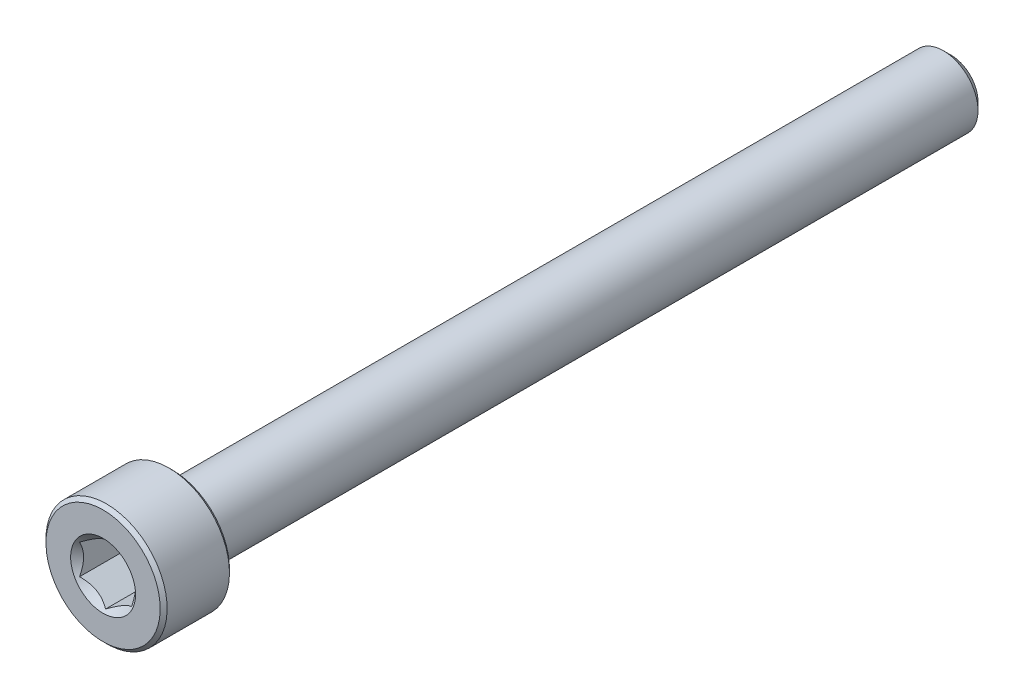
ISO-10303-21;
HEADER;
FILE_DESCRIPTION(('STEP AP214'),'2;1');
FILE_NAME('part.step','',(''),(''),'','','');
FILE_SCHEMA(('AUTOMOTIVE_DESIGN { 1 0 10303 214 1 1 1 1 }'));
ENDSEC;
DATA;
#1=APPLICATION_CONTEXT('core data for automotive mechanical design processes');
#2=APPLICATION_PROTOCOL_DEFINITION('international standard','automotive_design',2000,#1);
#3=PRODUCT_CONTEXT('',#1,'mechanical');
#4=PRODUCT('Part','Part','',(#3));
#5=PRODUCT_RELATED_PRODUCT_CATEGORY('part','',(#4));
#6=PRODUCT_DEFINITION_FORMATION('','',#4);
#7=PRODUCT_DEFINITION_CONTEXT('part definition',#1,'design');
#8=PRODUCT_DEFINITION('design','',#6,#7);
#9=PRODUCT_DEFINITION_SHAPE('','',#8);
#10=(LENGTH_UNIT() NAMED_UNIT(*) SI_UNIT(.MILLI.,.METRE.));
#11=(NAMED_UNIT(*) PLANE_ANGLE_UNIT() SI_UNIT($,.RADIAN.));
#12=(NAMED_UNIT(*) SI_UNIT($,.STERADIAN.) SOLID_ANGLE_UNIT());
#13=UNCERTAINTY_MEASURE_WITH_UNIT(LENGTH_MEASURE(1.E-05),#10,'distance_accuracy_value','');
#14=(GEOMETRIC_REPRESENTATION_CONTEXT(3) GLOBAL_UNCERTAINTY_ASSIGNED_CONTEXT((#13)) GLOBAL_UNIT_ASSIGNED_CONTEXT((#10,
#11,#12)) REPRESENTATION_CONTEXT('',''));
#15=CARTESIAN_POINT('',(0.,0.,0.));
#16=DIRECTION('',(0.,0.,1.));
#17=DIRECTION('',(1.,0.,0.));
#18=AXIS2_PLACEMENT_3D('',#15,#16,#17);
#19=CARTESIAN_POINT('',(0.,1.54533666301316,-24.5));
#20=DIRECTION('',(0.,0.,-1.));
#21=DIRECTION('',(0.,1.,0.));
#22=AXIS2_PLACEMENT_3D('',#19,#20,#21);
#23=PLANE('',#22);
#24=CARTESIAN_POINT('',(0.,0.,-24.5));
#25=DIRECTION('',(0.,0.,-1.));
#26=DIRECTION('',(0.,1.,0.));
#27=AXIS2_PLACEMENT_3D('',#24,#25,#26);
#28=CIRCLE('',#27,1.54533666301316);
#29=CARTESIAN_POINT('',(0.,1.54533666301316,-24.5));
#30=VERTEX_POINT('',#29);
#31=EDGE_CURVE('E54',#30,#30,#28,.T.);
#32=ORIENTED_EDGE('',*,*,#31,.T.);
#33=EDGE_LOOP('',(#32));
#34=FACE_BOUND('',#33,.T.);
#35=ADVANCED_FACE('F41',(#34),#23,.T.);
#36=CARTESIAN_POINT('',(0.,0.,-24.5));
#37=DIRECTION('',(0.,0.,1.));
#38=DIRECTION('',(0.,-1.,0.));
#39=AXIS2_PLACEMENT_3D('',#36,#37,#38);
#40=CONICAL_SURFACE('',#39,1.54533666301316,0.785398163397442);
#41=CARTESIAN_POINT('',(0.,0.,-24.0453366630132));
#42=DIRECTION('',(0.,0.,-1.));
#43=DIRECTION('',(0.,1.,0.));
#44=AXIS2_PLACEMENT_3D('',#41,#42,#43);
#45=CIRCLE('',#44,2.);
#46=CARTESIAN_POINT('',(0.,2.,-24.0453366630132));
#47=VERTEX_POINT('',#46);
#48=EDGE_CURVE('E157',#47,#47,#45,.T.);
#49=ORIENTED_EDGE('',*,*,#48,.T.);
#50=EDGE_LOOP('',(#49));
#51=FACE_BOUND('',#50,.T.);
#52=ORIENTED_EDGE('',*,*,#31,.F.);
#53=EDGE_LOOP('',(#52));
#54=FACE_BOUND('',#53,.T.);
#55=ADVANCED_FACE('F163',(#51,#54),#40,.T.);
#56=CARTESIAN_POINT('',(0.,0.,-24.5));
#57=DIRECTION('',(0.,0.,-1.));
#58=DIRECTION('',(0.,1.,0.));
#59=AXIS2_PLACEMENT_3D('',#56,#57,#58);
#60=CYLINDRICAL_SURFACE('',#59,2.);
#61=CARTESIAN_POINT('',(0.,0.,20.3));
#62=DIRECTION('',(0.,0.,-1.));
#63=DIRECTION('',(0.,1.,0.));
#64=AXIS2_PLACEMENT_3D('',#61,#62,#63);
#65=CIRCLE('',#64,2.);
#66=CARTESIAN_POINT('',(0.,2.,20.3));
#67=VERTEX_POINT('',#66);
#68=EDGE_CURVE('E154',#67,#67,#65,.T.);
#69=ORIENTED_EDGE('',*,*,#68,.T.);
#70=EDGE_LOOP('',(#69));
#71=FACE_BOUND('',#70,.T.);
#72=ORIENTED_EDGE('',*,*,#48,.F.);
#73=EDGE_LOOP('',(#72));
#74=FACE_BOUND('',#73,.T.);
#75=ADVANCED_FACE('F165',(#71,#74),#60,.T.);
#76=CARTESIAN_POINT('',(0.,0.,20.3));
#77=DIRECTION('',(0.,0.,-1.));
#78=DIRECTION('',(0.,1.,0.));
#79=AXIS2_PLACEMENT_3D('',#76,#77,#78);
#80=TOROIDAL_SURFACE('',#79,2.2,0.2);
#81=CARTESIAN_POINT('',(0.,0.,20.5));
#82=DIRECTION('',(0.,0.,-1.));
#83=DIRECTION('',(0.,1.,0.));
#84=AXIS2_PLACEMENT_3D('',#81,#82,#83);
#85=CIRCLE('',#84,2.2);
#86=CARTESIAN_POINT('',(0.,2.2,20.5));
#87=VERTEX_POINT('',#86);
#88=EDGE_CURVE('E151',#87,#87,#85,.T.);
#89=ORIENTED_EDGE('',*,*,#88,.T.);
#90=EDGE_LOOP('',(#89));
#91=FACE_BOUND('',#90,.T.);
#92=ORIENTED_EDGE('',*,*,#68,.F.);
#93=EDGE_LOOP('',(#92));
#94=FACE_BOUND('',#93,.T.);
#95=ADVANCED_FACE('F171',(#91,#94),#80,.F.);
#96=CARTESIAN_POINT('',(0.,3.3,20.5));
#97=DIRECTION('',(0.,0.,-1.));
#98=DIRECTION('',(0.,1.,0.));
#99=AXIS2_PLACEMENT_3D('',#96,#97,#98);
#100=PLANE('',#99);
#101=CARTESIAN_POINT('',(0.,0.,20.5));
#102=DIRECTION('',(0.,0.,-1.));
#103=DIRECTION('',(0.,1.,0.));
#104=AXIS2_PLACEMENT_3D('',#101,#102,#103);
#105=CIRCLE('',#104,3.3);
#106=CARTESIAN_POINT('',(0.,3.3,20.5));
#107=VERTEX_POINT('',#106);
#108=EDGE_CURVE('E148',#107,#107,#105,.T.);
#109=ORIENTED_EDGE('',*,*,#108,.T.);
#110=EDGE_LOOP('',(#109));
#111=FACE_BOUND('',#110,.T.);
#112=ORIENTED_EDGE('',*,*,#88,.F.);
#113=EDGE_LOOP('',(#112));
#114=FACE_BOUND('',#113,.T.);
#115=ADVANCED_FACE('F177',(#111,#114),#100,.T.);
#116=CARTESIAN_POINT('',(0.,0.,20.5));
#117=DIRECTION('',(0.,0.,1.));
#118=DIRECTION('',(0.,-1.,0.));
#119=AXIS2_PLACEMENT_3D('',#116,#117,#118);
#120=CONICAL_SURFACE('',#119,3.3,0.785398163397452);
#121=CARTESIAN_POINT('',(0.,0.,20.7));
#122=DIRECTION('',(0.,0.,-1.));
#123=DIRECTION('',(0.,1.,0.));
#124=AXIS2_PLACEMENT_3D('',#121,#122,#123);
#125=CIRCLE('',#124,3.5);
#126=CARTESIAN_POINT('',(0.,3.5,20.7));
#127=VERTEX_POINT('',#126);
#128=EDGE_CURVE('E145',#127,#127,#125,.T.);
#129=ORIENTED_EDGE('',*,*,#128,.T.);
#130=EDGE_LOOP('',(#129));
#131=FACE_BOUND('',#130,.T.);
#132=ORIENTED_EDGE('',*,*,#108,.F.);
#133=EDGE_LOOP('',(#132));
#134=FACE_BOUND('',#133,.T.);
#135=ADVANCED_FACE('F181',(#131,#134),#120,.T.);
#136=CARTESIAN_POINT('',(0.,0.,-24.5));
#137=DIRECTION('',(0.,0.,-1.));
#138=DIRECTION('',(0.,1.,0.));
#139=AXIS2_PLACEMENT_3D('',#136,#137,#138);
#140=CYLINDRICAL_SURFACE('',#139,3.5);
#141=CARTESIAN_POINT('',(0.,0.,24.3));
#142=DIRECTION('',(0.,0.,-1.));
#143=DIRECTION('',(0.,1.,0.));
#144=AXIS2_PLACEMENT_3D('',#141,#142,#143);
#145=CIRCLE('',#144,3.5);
#146=CARTESIAN_POINT('',(0.,3.5,24.3));
#147=VERTEX_POINT('',#146);
#148=EDGE_CURVE('E142',#147,#147,#145,.T.);
#149=ORIENTED_EDGE('',*,*,#148,.T.);
#150=EDGE_LOOP('',(#149));
#151=FACE_BOUND('',#150,.T.);
#152=ORIENTED_EDGE('',*,*,#128,.F.);
#153=EDGE_LOOP('',(#152));
#154=FACE_BOUND('',#153,.T.);
#155=ADVANCED_FACE('F185',(#151,#154),#140,.T.);
#156=CARTESIAN_POINT('',(0.,0.,24.3));
#157=DIRECTION('',(0.,0.,-1.));
#158=DIRECTION('',(0.,1.,0.));
#159=AXIS2_PLACEMENT_3D('',#156,#157,#158);
#160=CONICAL_SURFACE('',#159,3.5,0.785398163397452);
#161=CARTESIAN_POINT('',(0.,0.,24.5));
#162=DIRECTION('',(0.,0.,-1.));
#163=DIRECTION('',(0.,1.,0.));
#164=AXIS2_PLACEMENT_3D('',#161,#162,#163);
#165=CIRCLE('',#164,3.3);
#166=CARTESIAN_POINT('',(0.,3.3,24.5));
#167=VERTEX_POINT('',#166);
#168=EDGE_CURVE('E139',#167,#167,#165,.T.);
#169=ORIENTED_EDGE('',*,*,#168,.T.);
#170=EDGE_LOOP('',(#169));
#171=FACE_BOUND('',#170,.T.);
#172=ORIENTED_EDGE('',*,*,#148,.F.);
#173=EDGE_LOOP('',(#172));
#174=FACE_BOUND('',#173,.T.);
#175=ADVANCED_FACE('F189',(#171,#174),#160,.T.);
#176=CARTESIAN_POINT('',(0.,0.,24.5));
#177=DIRECTION('',(0.,0.,1.));
#178=DIRECTION('',(0.,-1.,0.));
#179=AXIS2_PLACEMENT_3D('',#176,#177,#178);
#180=PLANE('',#179);
#181=CARTESIAN_POINT('',(0.,0.,24.5));
#182=DIRECTION('',(0.,0.,1.));
#183=DIRECTION('',(1.,0.,0.));
#184=AXIS2_PLACEMENT_3D('',#181,#182,#183);
#185=CIRCLE('',#184,1.875);
#186=CARTESIAN_POINT('',(1.875,0.,24.5));
#187=VERTEX_POINT('',#186);
#188=EDGE_CURVE('E113',#187,#187,#185,.T.);
#189=ORIENTED_EDGE('',*,*,#188,.F.);
#190=EDGE_LOOP('',(#189));
#191=FACE_BOUND('',#190,.T.);
#192=ORIENTED_EDGE('',*,*,#168,.F.);
#193=EDGE_LOOP('',(#192));
#194=FACE_BOUND('',#193,.T.);
#195=ADVANCED_FACE('F193',(#191,#194),#180,.T.);
#196=CARTESIAN_POINT('',(0.,0.,24.5));
#197=DIRECTION('',(0.,0.,1.));
#198=DIRECTION('',(1.,0.,0.));
#199=AXIS2_PLACEMENT_3D('',#196,#197,#198);
#200=CONICAL_SURFACE('',#199,1.875,0.78539816339745);
#201=ORIENTED_EDGE('',*,*,#188,.T.);
#202=EDGE_LOOP('',(#201));
#203=FACE_BOUND('',#202,.T.);
#204=CARTESIAN_POINT('',(-0.000199999999999927,-1.73216627762272,24.357166289169));
#205=CARTESIAN_POINT('',(0.0513677907370756,-1.70239359975915,24.3274162836362));
#206=CARTESIAN_POINT('',(0.103797917665201,-1.67212305186355,24.2994132914792));
#207=CARTESIAN_POINT('',(0.210709034055597,-1.61039789003619,24.248140038009));
#208=CARTESIAN_POINT('',(0.265200195814662,-1.57893740312614,24.2248983126132));
#209=CARTESIAN_POINT('',(0.37507908135725,-1.51549879897987,24.1850845365611));
#210=CARTESIAN_POINT('',(0.430438809095201,-1.4835368452681,24.1684123932398));
#211=CARTESIAN_POINT('',(0.542377257477152,-1.41890915196211,24.142725264387));
#212=CARTESIAN_POINT('',(0.59895255655301,-1.38624538781118,24.1336910980477));
#213=CARTESIAN_POINT('',(0.696455389516442,-1.32995210095299,24.1255398887957));
#214=CARTESIAN_POINT('',(0.737256908280467,-1.30639533311124,24.1243330605581));
#215=CARTESIAN_POINT('',(0.818787969615859,-1.25932335290193,24.1263648647311));
#216=CARTESIAN_POINT('',(0.859517494314631,-1.23580815085313,24.1296044783172));
#217=CARTESIAN_POINT('',(0.940584402163417,-1.18900414978427,24.1403427935508));
#218=CARTESIAN_POINT('',(0.980921384598288,-1.16571558211719,24.1478454605876));
#219=CARTESIAN_POINT('',(1.06091833691403,-1.11952932016335,24.1667024194972));
#220=CARTESIAN_POINT('',(1.10057800851621,-1.09663179808786,24.1780583645875));
#221=CARTESIAN_POINT('',(1.20216313477449,-1.03798159809698,24.2117724551616));
#222=CARTESIAN_POINT('',(1.26345855370969,-1.00259267147465,24.2366726566622));
#223=CARTESIAN_POINT('',(1.35358562846331,-0.950557780604374,24.2787074608405));
#224=CARTESIAN_POINT('',(1.38328513990772,-0.933410759677147,24.293475961128));
#225=CARTESIAN_POINT('',(1.44213790138375,-0.899432101996407,24.324361373509));
#226=CARTESIAN_POINT('',(1.47129140422064,-0.88260031928571,24.3404776416906));
#227=CARTESIAN_POINT('',(1.5002,-0.865909933730601,24.357166289169));
#228=B_SPLINE_CURVE_WITH_KNOTS('',3,(#204,#205,#206,#207,#208,#209,#210,#211,#212,#213,#214,
#215,#216,#217,#218,#219,#220,#221,#222,#223,#224,#225,#226,#227),.UNSPECIFIED.,.F.,.F.,(4,2,2,
2,2,2,2,2,2,2,2,4),(0.,0.199829143693306,0.40082298738239,0.598623720538183,0.795926240188891,
0.937113067959882,1.07833105577193,1.21968061668222,1.36109089931055,1.58570969637566,
1.69770705470964,1.80965120737194),.UNSPECIFIED.);
#229=CARTESIAN_POINT('',(0.,-1.73205080756888,24.3570508075689));
#230=VERTEX_POINT('',#229);
#231=CARTESIAN_POINT('',(1.5,-0.866025403784439,24.3570508075689));
#232=VERTEX_POINT('',#231);
#233=EDGE_CURVE('E12',#230,#232,#228,.T.);
#234=ORIENTED_EDGE('',*,*,#233,.F.);
#235=CARTESIAN_POINT('',(-1.5002,-0.865909933730601,24.357166289169));
#236=CARTESIAN_POINT('',(-1.44863220926292,-0.895682611594166,24.3274162836362));
#237=CARTESIAN_POINT('',(-1.3962020823348,-0.925953159489765,24.2994132914792));
#238=CARTESIAN_POINT('',(-1.2892909659444,-0.987678321317124,24.248140038009));
#239=CARTESIAN_POINT('',(-1.23479980418534,-1.01913880822718,24.2248983126132));
#240=CARTESIAN_POINT('',(-1.12492091864275,-1.08257741237344,24.1850845365611));
#241=CARTESIAN_POINT('',(-1.0695611909048,-1.11453936608521,24.1684123932398));
#242=CARTESIAN_POINT('',(-0.957622742522848,-1.1791670593912,24.142725264387));
#243=CARTESIAN_POINT('',(-0.90104744344699,-1.21183082354213,24.1336910980477));
#244=CARTESIAN_POINT('',(-0.803544610483558,-1.26812411040032,24.1255398887957));
#245=CARTESIAN_POINT('',(-0.762743091719533,-1.29168087824208,24.1243330605581));
#246=CARTESIAN_POINT('',(-0.681212030384141,-1.33875285845138,24.1263648647311));
#247=CARTESIAN_POINT('',(-0.640482505685369,-1.36226806050018,24.1296044783172));
#248=CARTESIAN_POINT('',(-0.559415597836583,-1.40907206156905,24.1403427935508));
#249=CARTESIAN_POINT('',(-0.519078615401711,-1.43236062923612,24.1478454605876));
#250=CARTESIAN_POINT('',(-0.439081663085968,-1.47854689118997,24.1667024194972));
#251=CARTESIAN_POINT('',(-0.399421991483791,-1.50144441326545,24.1780583645875));
#252=CARTESIAN_POINT('',(-0.297836865225514,-1.56009461325633,24.2117724551616));
#253=CARTESIAN_POINT('',(-0.23654144629031,-1.59548353987866,24.2366726566622));
#254=CARTESIAN_POINT('',(-0.146414371536685,-1.64751843074894,24.2787074608405));
#255=CARTESIAN_POINT('',(-0.116714860092281,-1.66466545167617,24.293475961128));
#256=CARTESIAN_POINT('',(-0.0578620986162481,-1.69864410935691,24.324361373509));
#257=CARTESIAN_POINT('',(-0.0287085957793623,-1.71547589206761,24.3404776416906));
#258=CARTESIAN_POINT('',(0.000200000000000097,-1.73216627762272,24.357166289169));
#259=B_SPLINE_CURVE_WITH_KNOTS('',3,(#235,#236,#237,#238,#239,#240,#241,#242,#243,#244,#245,
#246,#247,#248,#249,#250,#251,#252,#253,#254,#255,#256,#257,#258),.UNSPECIFIED.,.F.,.F.,(4,2,2,
2,2,2,2,2,2,2,2,4),(0.,0.199829143693305,0.40082298738239,0.598623720538183,0.795926240188891,
0.937113067959882,1.07833105577193,1.21968061668222,1.36109089931055,1.58570969637566,
1.69770705470964,1.80965120737194),.UNSPECIFIED.);
#260=CARTESIAN_POINT('',(-1.5,-0.866025403784439,24.3570508075689));
#261=VERTEX_POINT('',#260);
#262=EDGE_CURVE('E99',#261,#230,#259,.T.);
#263=ORIENTED_EDGE('',*,*,#262,.F.);
#264=CARTESIAN_POINT('',(-1.5,-1.82724616303013,24.9890703331983));
#265=CARTESIAN_POINT('',(-1.5,-1.78317586660663,24.9550123999568));
#266=CARTESIAN_POINT('',(-1.5,-1.73887128511932,24.9212586157948));
#267=CARTESIAN_POINT('',(-1.5,-1.64969483826883,24.8544877722609));
#268=CARTESIAN_POINT('',(-1.5,-1.60482284303167,24.8214708865189));
#269=CARTESIAN_POINT('',(-1.5,-1.46855205058729,24.72324713276));
#270=CARTESIAN_POINT('',(-1.5,-1.37616527732981,24.6593888798091));
#271=CARTESIAN_POINT('',(-1.5,-1.18175814530896,24.5330655524142));
#272=CARTESIAN_POINT('',(-1.5,-1.07950173722928,24.4709600161031));
#273=CARTESIAN_POINT('',(-1.5,-0.869762030917011,24.3566969236549));
#274=CARTESIAN_POINT('',(-1.5,-0.762297993140726,24.3045057692236));
#275=CARTESIAN_POINT('',(-1.5,-0.601919355462973,24.2406274554858));
#276=CARTESIAN_POINT('',(-1.5,-0.551595099321827,24.2224734484817));
#277=CARTESIAN_POINT('',(-1.5,-0.449644044337812,24.1901962813812));
#278=CARTESIAN_POINT('',(-1.5,-0.398017164202741,24.1760733735321));
#279=CARTESIAN_POINT('',(-1.5,-0.294682921970128,24.1528602513053));
#280=CARTESIAN_POINT('',(-1.5,-0.242996732973226,24.1436773283499));
#281=CARTESIAN_POINT('',(-1.5,-0.138960185913601,24.1305401053432));
#282=CARTESIAN_POINT('',(-1.5,-0.0866099744986986,24.1265846704339));
#283=CARTESIAN_POINT('',(-1.5,0.0158213358469623,24.124249444396));
#284=CARTESIAN_POINT('',(-1.5,0.0658968533581915,24.125623217201));
#285=CARTESIAN_POINT('',(-1.5,0.165665754885725,24.1333003845672));
#286=CARTESIAN_POINT('',(-1.5,0.215359104450811,24.1396042184171));
#287=CARTESIAN_POINT('',(-1.5,0.314848006923594,24.1568886317293));
#288=CARTESIAN_POINT('',(-1.5,0.364628847818079,24.1679525303483));
#289=CARTESIAN_POINT('',(-1.5,0.463087713283467,24.1941391623975));
#290=CARTESIAN_POINT('',(-1.5,0.511765792737123,24.2092616933524));
#291=CARTESIAN_POINT('',(-1.5,0.660788843897247,24.2613608205824));
#292=CARTESIAN_POINT('',(-1.5,0.759116657247095,24.304088866007));
#293=CARTESIAN_POINT('',(-1.5,0.951184482463473,24.3991892536357));
#294=CARTESIAN_POINT('',(-1.5,1.04490689498042,24.4515954244168));
#295=CARTESIAN_POINT('',(-1.5,1.22407036992814,24.5598195550216));
#296=CARTESIAN_POINT('',(-1.5,1.30969196520695,24.6153424232839));
#297=CARTESIAN_POINT('',(-1.5,1.43583732283973,24.7012220441417));
#298=CARTESIAN_POINT('',(-1.5,1.47734359009407,24.7301606550632));
#299=CARTESIAN_POINT('',(-1.5,1.5597863256648,24.788815583058));
#300=CARTESIAN_POINT('',(-1.5,1.60072294793762,24.8185316834923));
#301=CARTESIAN_POINT('',(-1.5,1.64142194027435,24.8485705489177));
#302=B_SPLINE_CURVE_WITH_KNOTS('',3,(#264,#265,#266,#267,#268,#269,#270,#271,#272,#273,#274,
#275,#276,#277,#278,#279,#280,#281,#282,#283,#284,#285,#286,#287,#288,#289,#290,#291,#292,#293,
#294,#295,#296,#297,#298,#299,#300,#301),.UNSPECIFIED.,.F.,.F.,(4,2,2,2,2,2,2,2,2,2,2,2,2,2,2,2,
2,2,4),(0.,0.16708643660166,0.334211835551279,0.671001298251584,1.02965358816391,
1.38706788816987,1.54743005800718,1.70780226036013,1.86504930542637,2.02226220743606,
2.17229379545787,2.32233875343611,2.47512433054573,2.62790228697088,2.94859878977715,
3.27043822191845,3.57642907004228,3.72821874189077,3.87996656039159),.UNSPECIFIED.);
#303=CARTESIAN_POINT('',(-1.5,0.866025403784438,24.3570508075689));
#304=VERTEX_POINT('',#303);
#305=EDGE_CURVE('E112',#304,#261,#302,.F.);
#306=ORIENTED_EDGE('',*,*,#305,.F.);
#307=CARTESIAN_POINT('',(0.000199999999999728,1.73216627762271,24.357166289169));
#308=CARTESIAN_POINT('',(-0.0513677907370756,1.70239359975915,24.3274162836362));
#309=CARTESIAN_POINT('',(-0.103797917665201,1.67212305186355,24.2994132914792));
#310=CARTESIAN_POINT('',(-0.210709034055597,1.61039789003619,24.248140038009));
#311=CARTESIAN_POINT('',(-0.265200195814662,1.57893740312614,24.2248983126132));
#312=CARTESIAN_POINT('',(-0.37507908135725,1.51549879897987,24.1850845365611));
#313=CARTESIAN_POINT('',(-0.430438809095201,1.4835368452681,24.1684123932398));
#314=CARTESIAN_POINT('',(-0.542377257477152,1.41890915196211,24.142725264387));
#315=CARTESIAN_POINT('',(-0.59895255655301,1.38624538781118,24.1336910980477));
#316=CARTESIAN_POINT('',(-0.696455389516442,1.32995210095299,24.1255398887957));
#317=CARTESIAN_POINT('',(-0.737256908280467,1.30639533311124,24.1243330605581));
#318=CARTESIAN_POINT('',(-0.818787969615859,1.25932335290193,24.1263648647311));
#319=CARTESIAN_POINT('',(-0.859517494314631,1.23580815085313,24.1296044783172));
#320=CARTESIAN_POINT('',(-0.940584402163417,1.18900414978426,24.1403427935508));
#321=CARTESIAN_POINT('',(-0.980921384598289,1.16571558211719,24.1478454605876));
#322=CARTESIAN_POINT('',(-1.06091833691403,1.11952932016335,24.1667024194972));
#323=CARTESIAN_POINT('',(-1.10057800851621,1.09663179808786,24.1780583645875));
#324=CARTESIAN_POINT('',(-1.20216313477449,1.03798159809698,24.2117724551616));
#325=CARTESIAN_POINT('',(-1.26345855370969,1.00259267147465,24.2366726566622));
#326=CARTESIAN_POINT('',(-1.35358562846331,0.950557780604374,24.2787074608405));
#327=CARTESIAN_POINT('',(-1.38328513990772,0.933410759677148,24.293475961128));
#328=CARTESIAN_POINT('',(-1.44213790138375,0.899432101996407,24.324361373509));
#329=CARTESIAN_POINT('',(-1.47129140422064,0.88260031928571,24.3404776416906));
#330=CARTESIAN_POINT('',(-1.5002,0.865909933730601,24.357166289169));
#331=B_SPLINE_CURVE_WITH_KNOTS('',3,(#307,#308,#309,#310,#311,#312,#313,#314,#315,#316,#317,
#318,#319,#320,#321,#322,#323,#324,#325,#326,#327,#328,#329,#330),.UNSPECIFIED.,.F.,.F.,(4,2,2,
2,2,2,2,2,2,2,2,4),(0.,0.199829143693306,0.40082298738239,0.598623720538183,0.795926240188891,
0.937113067959883,1.07833105577193,1.21968061668222,1.36109089931055,1.58570969637566,
1.69770705470963,1.80965120737194),.UNSPECIFIED.);
#332=CARTESIAN_POINT('',(0.,1.73205080756888,24.3570508075689));
#333=VERTEX_POINT('',#332);
#334=EDGE_CURVE('E243',#333,#304,#331,.T.);
#335=ORIENTED_EDGE('',*,*,#334,.F.);
#336=CARTESIAN_POINT('',(1.5002,0.865909933730601,24.357166289169));
#337=CARTESIAN_POINT('',(1.44863220926292,0.895682611594165,24.3274162836362));
#338=CARTESIAN_POINT('',(1.3962020823348,0.925953159489765,24.2994132914792));
#339=CARTESIAN_POINT('',(1.2892909659444,0.987678321317123,24.248140038009));
#340=CARTESIAN_POINT('',(1.23479980418534,1.01913880822717,24.2248983126132));
#341=CARTESIAN_POINT('',(1.12492091864275,1.08257741237344,24.1850845365611));
#342=CARTESIAN_POINT('',(1.0695611909048,1.11453936608521,24.1684123932398));
#343=CARTESIAN_POINT('',(0.957622742522848,1.1791670593912,24.142725264387));
#344=CARTESIAN_POINT('',(0.90104744344699,1.21183082354213,24.1336910980477));
#345=CARTESIAN_POINT('',(0.803544610483558,1.26812411040032,24.1255398887957));
#346=CARTESIAN_POINT('',(0.762743091719532,1.29168087824208,24.1243330605581));
#347=CARTESIAN_POINT('',(0.68121203038414,1.33875285845138,24.1263648647311));
#348=CARTESIAN_POINT('',(0.640482505685369,1.36226806050018,24.1296044783172));
#349=CARTESIAN_POINT('',(0.559415597836583,1.40907206156905,24.1403427935508));
#350=CARTESIAN_POINT('',(0.51907861540171,1.43236062923612,24.1478454605876));
#351=CARTESIAN_POINT('',(0.439081663085968,1.47854689118996,24.1667024194972));
#352=CARTESIAN_POINT('',(0.399421991483791,1.50144441326545,24.1780583645875));
#353=CARTESIAN_POINT('',(0.297836865225514,1.56009461325633,24.2117724551616));
#354=CARTESIAN_POINT('',(0.236541446290309,1.59548353987866,24.2366726566622));
#355=CARTESIAN_POINT('',(0.146414371536685,1.64751843074894,24.2787074608405));
#356=CARTESIAN_POINT('',(0.116714860092281,1.66466545167617,24.293475961128));
#357=CARTESIAN_POINT('',(0.0578620986162488,1.69864410935691,24.324361373509));
#358=CARTESIAN_POINT('',(0.0287085957793627,1.71547589206761,24.3404776416906));
#359=CARTESIAN_POINT('',(-0.000200000000000084,1.73216627762271,24.357166289169));
#360=B_SPLINE_CURVE_WITH_KNOTS('',3,(#336,#337,#338,#339,#340,#341,#342,#343,#344,#345,#346,
#347,#348,#349,#350,#351,#352,#353,#354,#355,#356,#357,#358,#359),.UNSPECIFIED.,.F.,.F.,(4,2,2,
2,2,2,2,2,2,2,2,4),(0.,0.199829143693306,0.40082298738239,0.598623720538183,0.795926240188891,
0.937113067959883,1.07833105577193,1.21968061668222,1.36109089931055,1.58570969637566,
1.69770705470964,1.80965120737194),.UNSPECIFIED.);
#361=CARTESIAN_POINT('',(1.5,0.866025403784439,24.3570508075689));
#362=VERTEX_POINT('',#361);
#363=EDGE_CURVE('E216',#362,#333,#360,.T.);
#364=ORIENTED_EDGE('',*,*,#363,.F.);
#365=CARTESIAN_POINT('',(1.5,-1.82724616303013,24.9890703331983));
#366=CARTESIAN_POINT('',(1.5,-1.78317586660663,24.9550123999568));
#367=CARTESIAN_POINT('',(1.5,-1.73887128511932,24.9212586157948));
#368=CARTESIAN_POINT('',(1.5,-1.64969483826883,24.8544877722609));
#369=CARTESIAN_POINT('',(1.5,-1.60482284303167,24.8214708865189));
#370=CARTESIAN_POINT('',(1.5,-1.46855205058729,24.72324713276));
#371=CARTESIAN_POINT('',(1.5,-1.37616527732981,24.6593888798091));
#372=CARTESIAN_POINT('',(1.5,-1.18175814530897,24.5330655524142));
#373=CARTESIAN_POINT('',(1.5,-1.07950173722928,24.4709600161031));
#374=CARTESIAN_POINT('',(1.5,-0.869762030917011,24.3566969236549));
#375=CARTESIAN_POINT('',(1.5,-0.762297993140726,24.3045057692236));
#376=CARTESIAN_POINT('',(1.5,-0.601919355462972,24.2406274554858));
#377=CARTESIAN_POINT('',(1.5,-0.551595099321827,24.2224734484817));
#378=CARTESIAN_POINT('',(1.5,-0.449644044337812,24.1901962813812));
#379=CARTESIAN_POINT('',(1.5,-0.39801716420274,24.1760733735321));
#380=CARTESIAN_POINT('',(1.5,-0.294682921970127,24.1528602513053));
#381=CARTESIAN_POINT('',(1.5,-0.242996732973226,24.1436773283499));
#382=CARTESIAN_POINT('',(1.5,-0.138960185913601,24.1305401053432));
#383=CARTESIAN_POINT('',(1.5,-0.086609974498699,24.1265846704339));
#384=CARTESIAN_POINT('',(1.5,0.0158213358469615,24.124249444396));
#385=CARTESIAN_POINT('',(1.5,0.0658968533581908,24.125623217201));
#386=CARTESIAN_POINT('',(1.5,0.165665754885724,24.1333003845672));
#387=CARTESIAN_POINT('',(1.5,0.21535910445081,24.1396042184171));
#388=CARTESIAN_POINT('',(1.5,0.314848006923593,24.1568886317293));
#389=CARTESIAN_POINT('',(1.5,0.36462884781808,24.1679525303483));
#390=CARTESIAN_POINT('',(1.5,0.463087713283468,24.1941391623975));
#391=CARTESIAN_POINT('',(1.5,0.511765792737123,24.2092616933524));
#392=CARTESIAN_POINT('',(1.5,0.660788843897247,24.2613608205824));
#393=CARTESIAN_POINT('',(1.5,0.759116657247095,24.304088866007));
#394=CARTESIAN_POINT('',(1.5,0.951184482463472,24.3991892536357));
#395=CARTESIAN_POINT('',(1.5,1.04490689498042,24.4515954244168));
#396=CARTESIAN_POINT('',(1.5,1.22407036992814,24.5598195550216));
#397=CARTESIAN_POINT('',(1.5,1.30969196520695,24.6153424232839));
#398=CARTESIAN_POINT('',(1.5,1.43583732283972,24.7012220441417));
#399=CARTESIAN_POINT('',(1.5,1.47734359009407,24.7301606550632));
#400=CARTESIAN_POINT('',(1.5,1.5597863256648,24.788815583058));
#401=CARTESIAN_POINT('',(1.5,1.60072294793762,24.8185316834923));
#402=CARTESIAN_POINT('',(1.5,1.64142194027435,24.8485705489177));
#403=B_SPLINE_CURVE_WITH_KNOTS('',3,(#365,#366,#367,#368,#369,#370,#371,#372,#373,#374,#375,
#376,#377,#378,#379,#380,#381,#382,#383,#384,#385,#386,#387,#388,#389,#390,#391,#392,#393,#394,
#395,#396,#397,#398,#399,#400,#401,#402),.UNSPECIFIED.,.F.,.F.,(4,2,2,2,2,2,2,2,2,2,2,2,2,2,2,2,
2,2,4),(0.,0.16708643660166,0.33421183555128,0.671001298251584,1.02965358816391,
1.38706788816987,1.54743005800718,1.70780226036013,1.86504930542637,2.02226220743606,
2.17229379545787,2.32233875343611,2.47512433054573,2.62790228697088,2.94859878977715,
3.27043822191845,3.57642907004227,3.72821874189076,3.87996656039159),.UNSPECIFIED.);
#404=EDGE_CURVE('E61',#232,#362,#403,.T.);
#405=ORIENTED_EDGE('',*,*,#404,.F.);
#406=EDGE_LOOP('',(#234,#263,#306,#335,#364,#405));
#407=FACE_BOUND('',#406,.T.);
#408=ADVANCED_FACE('F98',(#203,#407),#200,.F.);
#409=CARTESIAN_POINT('',(0.,3.3,21.5));
#410=DIRECTION('',(0.,0.,-1.));
#411=DIRECTION('',(0.,1.,0.));
#412=AXIS2_PLACEMENT_3D('',#409,#410,#411);
#413=PLANE('',#412);
#414=DIRECTION('',(0.866025403784439,0.5,0.));
#415=VECTOR('',#414,1.);
#416=CARTESIAN_POINT('',(0.,-1.73205080756888,21.5));
#417=LINE('',#416,#415);
#418=CARTESIAN_POINT('',(0.,-1.73205080756888,21.5));
#419=VERTEX_POINT('',#418);
#420=CARTESIAN_POINT('',(1.5,-0.866025403784439,21.5));
#421=VERTEX_POINT('',#420);
#422=EDGE_CURVE('E116',#419,#421,#417,.T.);
#423=ORIENTED_EDGE('',*,*,#422,.T.);
#424=DIRECTION('',(0.,1.,0.));
#425=VECTOR('',#424,1.);
#426=CARTESIAN_POINT('',(1.5,-0.866025403784439,21.5));
#427=LINE('',#426,#425);
#428=CARTESIAN_POINT('',(1.5,0.866025403784438,21.5));
#429=VERTEX_POINT('',#428);
#430=EDGE_CURVE('E68',#421,#429,#427,.T.);
#431=ORIENTED_EDGE('',*,*,#430,.T.);
#432=DIRECTION('',(-0.866025403784439,0.5,0.));
#433=VECTOR('',#432,1.);
#434=CARTESIAN_POINT('',(1.5,0.866025403784438,21.5));
#435=LINE('',#434,#433);
#436=CARTESIAN_POINT('',(0.,1.73205080756888,21.5));
#437=VERTEX_POINT('',#436);
#438=EDGE_CURVE('E124',#429,#437,#435,.T.);
#439=ORIENTED_EDGE('',*,*,#438,.T.);
#440=DIRECTION('',(-0.866025403784439,-0.5,0.));
#441=VECTOR('',#440,1.);
#442=CARTESIAN_POINT('',(0.,1.73205080756888,21.5));
#443=LINE('',#442,#441);
#444=CARTESIAN_POINT('',(-1.5,0.866025403784439,21.5));
#445=VERTEX_POINT('',#444);
#446=EDGE_CURVE('E131',#437,#445,#443,.T.);
#447=ORIENTED_EDGE('',*,*,#446,.T.);
#448=DIRECTION('',(0.,-1.,0.));
#449=VECTOR('',#448,1.);
#450=CARTESIAN_POINT('',(-1.5,0.866025403784438,21.5));
#451=LINE('',#450,#449);
#452=CARTESIAN_POINT('',(-1.5,-0.866025403784439,21.5));
#453=VERTEX_POINT('',#452);
#454=EDGE_CURVE('E127',#445,#453,#451,.T.);
#455=ORIENTED_EDGE('',*,*,#454,.T.);
#456=DIRECTION('',(0.866025403784439,-0.5,0.));
#457=VECTOR('',#456,1.);
#458=CARTESIAN_POINT('',(-1.5,-0.866025403784439,21.5));
#459=LINE('',#458,#457);
#460=EDGE_CURVE('E117',#453,#419,#459,.T.);
#461=ORIENTED_EDGE('',*,*,#460,.T.);
#462=EDGE_LOOP('',(#423,#431,#439,#447,#455,#461));
#463=FACE_BOUND('',#462,.T.);
#464=ADVANCED_FACE('F198',(#463),#413,.F.);
#465=CARTESIAN_POINT('',(0.,-1.73205080756888,15.9174243050442));
#466=DIRECTION('',(0.5,-0.866025403784439,0.));
#467=DIRECTION('',(0.866025403784439,0.5,0.));
#468=AXIS2_PLACEMENT_3D('',#465,#466,#467);
#469=PLANE('',#468);
#470=DIRECTION('',(0.,0.,1.));
#471=VECTOR('',#470,1.);
#472=CARTESIAN_POINT('',(0.,-1.73205080756888,15.9174243050442));
#473=LINE('',#472,#471);
#474=EDGE_CURVE('E108',#419,#230,#473,.T.);
#475=ORIENTED_EDGE('',*,*,#474,.T.);
#476=ORIENTED_EDGE('',*,*,#233,.T.);
#477=DIRECTION('',(0.,0.,1.));
#478=VECTOR('',#477,1.);
#479=CARTESIAN_POINT('',(1.5,-0.866025403784439,15.9174243050442));
#480=LINE('',#479,#478);
#481=EDGE_CURVE('E119',#421,#232,#480,.T.);
#482=ORIENTED_EDGE('',*,*,#481,.F.);
#483=ORIENTED_EDGE('',*,*,#422,.F.);
#484=EDGE_LOOP('',(#475,#476,#482,#483));
#485=FACE_BOUND('',#484,.T.);
#486=ADVANCED_FACE('F115',(#485),#469,.F.);
#487=CARTESIAN_POINT('',(-1.5,-0.866025403784439,15.9174243050442));
#488=DIRECTION('',(-0.5,-0.866025403784439,0.));
#489=DIRECTION('',(0.866025403784439,-0.5,0.));
#490=AXIS2_PLACEMENT_3D('',#487,#488,#489);
#491=PLANE('',#490);
#492=DIRECTION('',(0.,0.,1.));
#493=VECTOR('',#492,1.);
#494=CARTESIAN_POINT('',(-1.5,-0.866025403784439,15.9174243050442));
#495=LINE('',#494,#493);
#496=EDGE_CURVE('E111',#453,#261,#495,.T.);
#497=ORIENTED_EDGE('',*,*,#496,.T.);
#498=ORIENTED_EDGE('',*,*,#262,.T.);
#499=ORIENTED_EDGE('',*,*,#474,.F.);
#500=ORIENTED_EDGE('',*,*,#460,.F.);
#501=EDGE_LOOP('',(#497,#498,#499,#500));
#502=FACE_BOUND('',#501,.T.);
#503=ADVANCED_FACE('F107',(#502),#491,.F.);
#504=CARTESIAN_POINT('',(-1.5,0.866025403784438,15.9174243050442));
#505=DIRECTION('',(-1.,0.,0.));
#506=DIRECTION('',(0.,0.,1.));
#507=AXIS2_PLACEMENT_3D('',#504,#505,#506);
#508=PLANE('',#507);
#509=DIRECTION('',(0.,0.,1.));
#510=VECTOR('',#509,1.);
#511=CARTESIAN_POINT('',(-1.5,0.866025403784438,15.9174243050442));
#512=LINE('',#511,#510);
#513=EDGE_CURVE('E128',#445,#304,#512,.T.);
#514=ORIENTED_EDGE('',*,*,#513,.T.);
#515=ORIENTED_EDGE('',*,*,#305,.T.);
#516=ORIENTED_EDGE('',*,*,#496,.F.);
#517=ORIENTED_EDGE('',*,*,#454,.F.);
#518=EDGE_LOOP('',(#514,#515,#516,#517));
#519=FACE_BOUND('',#518,.T.);
#520=ADVANCED_FACE('F252',(#519),#508,.F.);
#521=CARTESIAN_POINT('',(0.,1.73205080756888,15.9174243050442));
#522=DIRECTION('',(-0.5,0.866025403784439,0.));
#523=DIRECTION('',(-0.866025403784439,-0.5,0.));
#524=AXIS2_PLACEMENT_3D('',#521,#522,#523);
#525=PLANE('',#524);
#526=DIRECTION('',(0.,0.,1.));
#527=VECTOR('',#526,1.);
#528=CARTESIAN_POINT('',(0.,1.73205080756888,15.9174243050442));
#529=LINE('',#528,#527);
#530=EDGE_CURVE('E132',#437,#333,#529,.T.);
#531=ORIENTED_EDGE('',*,*,#530,.T.);
#532=ORIENTED_EDGE('',*,*,#334,.T.);
#533=ORIENTED_EDGE('',*,*,#513,.F.);
#534=ORIENTED_EDGE('',*,*,#446,.F.);
#535=EDGE_LOOP('',(#531,#532,#533,#534));
#536=FACE_BOUND('',#535,.T.);
#537=ADVANCED_FACE('F249',(#536),#525,.F.);
#538=CARTESIAN_POINT('',(1.5,0.866025403784438,15.9174243050442));
#539=DIRECTION('',(0.5,0.866025403784439,0.));
#540=DIRECTION('',(-0.866025403784439,0.5,0.));
#541=AXIS2_PLACEMENT_3D('',#538,#539,#540);
#542=PLANE('',#541);
#543=DIRECTION('',(0.,0.,1.));
#544=VECTOR('',#543,1.);
#545=CARTESIAN_POINT('',(1.5,0.866025403784438,15.9174243050442));
#546=LINE('',#545,#544);
#547=EDGE_CURVE('E135',#429,#362,#546,.T.);
#548=ORIENTED_EDGE('',*,*,#547,.T.);
#549=ORIENTED_EDGE('',*,*,#363,.T.);
#550=ORIENTED_EDGE('',*,*,#530,.F.);
#551=ORIENTED_EDGE('',*,*,#438,.F.);
#552=EDGE_LOOP('',(#548,#549,#550,#551));
#553=FACE_BOUND('',#552,.T.);
#554=ADVANCED_FACE('F206',(#553),#542,.F.);
#555=CARTESIAN_POINT('',(1.5,-0.866025403784439,15.9174243050442));
#556=DIRECTION('',(1.,0.,0.));
#557=DIRECTION('',(0.,0.,-1.));
#558=AXIS2_PLACEMENT_3D('',#555,#556,#557);
#559=PLANE('',#558);
#560=ORIENTED_EDGE('',*,*,#481,.T.);
#561=ORIENTED_EDGE('',*,*,#404,.T.);
#562=ORIENTED_EDGE('',*,*,#547,.F.);
#563=ORIENTED_EDGE('',*,*,#430,.F.);
#564=EDGE_LOOP('',(#560,#561,#562,#563));
#565=FACE_BOUND('',#564,.T.);
#566=ADVANCED_FACE('F202',(#565),#559,.F.);
#567=CLOSED_SHELL('',(#35,#55,#75,#95,#115,#135,#155,#175,#195,#408,#464,#486,#503,#520,#537,
#554,#566));
#568=MANIFOLD_SOLID_BREP('B2',#567);
#569=ADVANCED_BREP_SHAPE_REPRESENTATION('',(#18,#568),#14);
#570=SHAPE_DEFINITION_REPRESENTATION(#9,#569);
ENDSEC;
END-ISO-10303-21;
